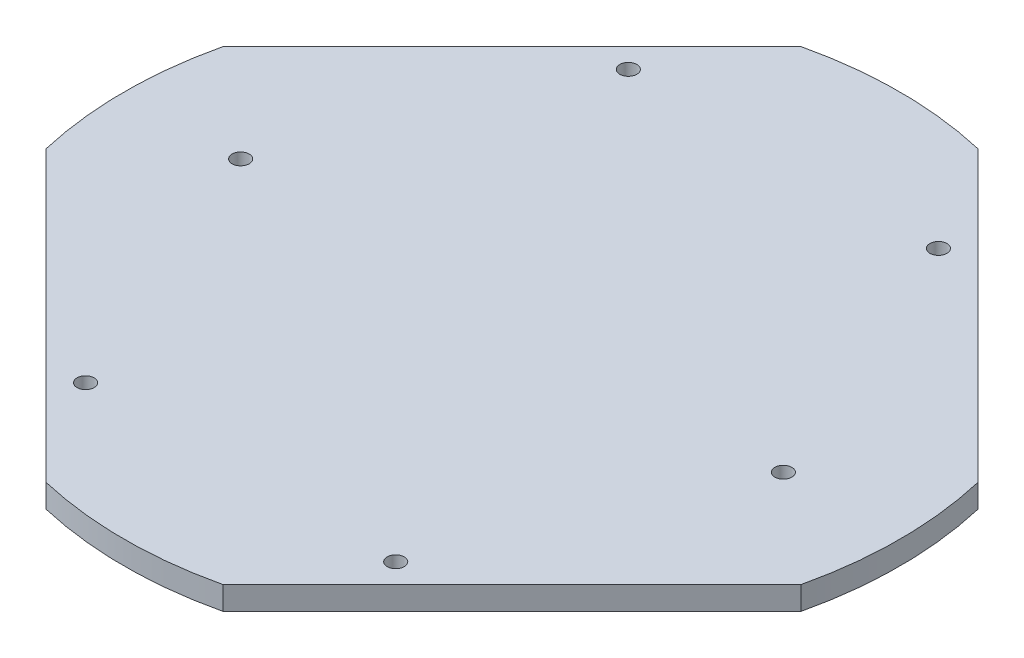
ISO-10303-21;
HEADER;
FILE_DESCRIPTION(('STEP AP214'),'2;1');
FILE_NAME('part.step','',(''),(''),'','','');
FILE_SCHEMA(('AUTOMOTIVE_DESIGN { 1 0 10303 214 1 1 1 1 }'));
ENDSEC;
DATA;
#1=APPLICATION_CONTEXT('core data for automotive mechanical design processes');
#2=APPLICATION_PROTOCOL_DEFINITION('international standard','automotive_design',2000,#1);
#3=PRODUCT_CONTEXT('',#1,'mechanical');
#4=PRODUCT('Part','Part','',(#3));
#5=PRODUCT_RELATED_PRODUCT_CATEGORY('part','',(#4));
#6=PRODUCT_DEFINITION_FORMATION('','',#4);
#7=PRODUCT_DEFINITION_CONTEXT('part definition',#1,'design');
#8=PRODUCT_DEFINITION('design','',#6,#7);
#9=PRODUCT_DEFINITION_SHAPE('','',#8);
#10=(LENGTH_UNIT() NAMED_UNIT(*) SI_UNIT(.MILLI.,.METRE.));
#11=(NAMED_UNIT(*) PLANE_ANGLE_UNIT() SI_UNIT($,.RADIAN.));
#12=(NAMED_UNIT(*) SI_UNIT($,.STERADIAN.) SOLID_ANGLE_UNIT());
#13=UNCERTAINTY_MEASURE_WITH_UNIT(LENGTH_MEASURE(1.E-05),#10,'distance_accuracy_value','');
#14=(GEOMETRIC_REPRESENTATION_CONTEXT(3) GLOBAL_UNCERTAINTY_ASSIGNED_CONTEXT((#13)) GLOBAL_UNIT_ASSIGNED_CONTEXT((#10,
#11,#12)) REPRESENTATION_CONTEXT('',''));
#15=CARTESIAN_POINT('',(0.,0.,0.));
#16=DIRECTION('',(0.,0.,1.));
#17=DIRECTION('',(1.,0.,0.));
#18=AXIS2_PLACEMENT_3D('',#15,#16,#17);
#19=CARTESIAN_POINT('',(0.,6.,0.));
#20=DIRECTION('',(0.,-1.,0.));
#21=DIRECTION('',(0.,0.,-1.));
#22=AXIS2_PLACEMENT_3D('',#19,#20,#21);
#23=CYLINDRICAL_SURFACE('',#22,100.);
#24=CARTESIAN_POINT('',(0.,0.,0.));
#25=DIRECTION('',(0.,1.,0.));
#26=DIRECTION('',(0.,0.,1.));
#27=AXIS2_PLACEMENT_3D('',#24,#25,#26);
#28=CIRCLE('',#27,100.);
#29=CARTESIAN_POINT('',(-22.8549153364782,0.,97.3532374652349));
#30=VERTEX_POINT('',#29);
#31=CARTESIAN_POINT('',(22.8549153364782,0.,97.3532374652349));
#32=VERTEX_POINT('',#31);
#33=EDGE_CURVE('E135',#30,#32,#28,.T.);
#34=ORIENTED_EDGE('',*,*,#33,.T.);
#35=DIRECTION('',(0.,-1.,0.));
#36=VECTOR('',#35,1.);
#37=CARTESIAN_POINT('',(22.8549153364782,6.,97.3532374652349));
#38=LINE('',#37,#36);
#39=CARTESIAN_POINT('',(22.8549153364782,6.,97.3532374652349));
#40=VERTEX_POINT('',#39);
#41=EDGE_CURVE('E11',#40,#32,#38,.T.);
#42=ORIENTED_EDGE('',*,*,#41,.F.);
#43=CARTESIAN_POINT('',(0.,6.,0.));
#44=DIRECTION('',(0.,1.,0.));
#45=DIRECTION('',(0.,0.,1.));
#46=AXIS2_PLACEMENT_3D('',#43,#44,#45);
#47=CIRCLE('',#46,100.);
#48=CARTESIAN_POINT('',(-22.8549153364782,6.,97.3532374652349));
#49=VERTEX_POINT('',#48);
#50=EDGE_CURVE('E150',#49,#40,#47,.T.);
#51=ORIENTED_EDGE('',*,*,#50,.F.);
#52=DIRECTION('',(0.,-1.,0.));
#53=VECTOR('',#52,1.);
#54=CARTESIAN_POINT('',(-22.8549153364782,6.,97.3532374652349));
#55=LINE('',#54,#53);
#56=EDGE_CURVE('E131',#49,#30,#55,.T.);
#57=ORIENTED_EDGE('',*,*,#56,.T.);
#58=EDGE_LOOP('',(#34,#42,#51,#57));
#59=FACE_BOUND('',#58,.T.);
#60=ADVANCED_FACE('F39',(#59),#23,.T.);
#61=CARTESIAN_POINT('',(97.3532374652349,6.,22.8549153364781));
#62=DIRECTION('',(-0.707106781186548,0.,-0.707106781186547));
#63=DIRECTION('',(-0.707106781186547,0.,0.707106781186548));
#64=AXIS2_PLACEMENT_3D('',#61,#62,#63);
#65=PLANE('',#64);
#66=DIRECTION('',(0.707106781186547,0.,-0.707106781186548));
#67=VECTOR('',#66,1.);
#68=CARTESIAN_POINT('',(97.3532374652349,0.,22.8549153364781));
#69=LINE('',#68,#67);
#70=CARTESIAN_POINT('',(97.3532374652349,0.,22.8549153364781));
#71=VERTEX_POINT('',#70);
#72=EDGE_CURVE('E138',#32,#71,#69,.T.);
#73=ORIENTED_EDGE('',*,*,#72,.T.);
#74=DIRECTION('',(0.,-1.,0.));
#75=VECTOR('',#74,1.);
#76=CARTESIAN_POINT('',(97.3532374652349,6.,22.8549153364781));
#77=LINE('',#76,#75);
#78=CARTESIAN_POINT('',(97.3532374652349,6.,22.8549153364781));
#79=VERTEX_POINT('',#78);
#80=EDGE_CURVE('E47',#79,#71,#77,.T.);
#81=ORIENTED_EDGE('',*,*,#80,.F.);
#82=DIRECTION('',(0.707106781186547,0.,-0.707106781186548));
#83=VECTOR('',#82,1.);
#84=CARTESIAN_POINT('',(97.3532374652349,6.,22.8549153364781));
#85=LINE('',#84,#83);
#86=EDGE_CURVE('E98',#40,#79,#85,.T.);
#87=ORIENTED_EDGE('',*,*,#86,.F.);
#88=ORIENTED_EDGE('',*,*,#41,.T.);
#89=EDGE_LOOP('',(#73,#81,#87,#88));
#90=FACE_BOUND('',#89,.T.);
#91=ADVANCED_FACE('F246',(#90),#65,.F.);
#92=CARTESIAN_POINT('',(0.,6.,0.));
#93=DIRECTION('',(0.,-1.,0.));
#94=DIRECTION('',(0.,0.,-1.));
#95=AXIS2_PLACEMENT_3D('',#92,#93,#94);
#96=CYLINDRICAL_SURFACE('',#95,100.);
#97=CARTESIAN_POINT('',(0.,0.,0.));
#98=DIRECTION('',(0.,1.,0.));
#99=DIRECTION('',(0.,0.,1.));
#100=AXIS2_PLACEMENT_3D('',#97,#98,#99);
#101=CIRCLE('',#100,100.);
#102=CARTESIAN_POINT('',(97.3532374652349,0.,-22.8549153364782));
#103=VERTEX_POINT('',#102);
#104=EDGE_CURVE('E141',#71,#103,#101,.T.);
#105=ORIENTED_EDGE('',*,*,#104,.T.);
#106=DIRECTION('',(0.,-1.,0.));
#107=VECTOR('',#106,1.);
#108=CARTESIAN_POINT('',(97.3532374652349,6.,-22.8549153364782));
#109=LINE('',#108,#107);
#110=CARTESIAN_POINT('',(97.3532374652349,6.,-22.8549153364782));
#111=VERTEX_POINT('',#110);
#112=EDGE_CURVE('E157',#111,#103,#109,.T.);
#113=ORIENTED_EDGE('',*,*,#112,.F.);
#114=CARTESIAN_POINT('',(0.,6.,0.));
#115=DIRECTION('',(0.,1.,0.));
#116=DIRECTION('',(0.,0.,1.));
#117=AXIS2_PLACEMENT_3D('',#114,#115,#116);
#118=CIRCLE('',#117,100.);
#119=EDGE_CURVE('E165',#79,#111,#118,.T.);
#120=ORIENTED_EDGE('',*,*,#119,.F.);
#121=ORIENTED_EDGE('',*,*,#80,.T.);
#122=EDGE_LOOP('',(#105,#113,#120,#121));
#123=FACE_BOUND('',#122,.T.);
#124=ADVANCED_FACE('F163',(#123),#96,.T.);
#125=CARTESIAN_POINT('',(97.3532374652349,6.,-22.8549153364782));
#126=DIRECTION('',(-0.707106781186547,0.,0.707106781186548));
#127=DIRECTION('',(0.707106781186548,0.,0.707106781186547));
#128=AXIS2_PLACEMENT_3D('',#125,#126,#127);
#129=PLANE('',#128);
#130=DIRECTION('',(-0.707106781186548,0.,-0.707106781186547));
#131=VECTOR('',#130,1.);
#132=CARTESIAN_POINT('',(97.3532374652349,0.,-22.8549153364782));
#133=LINE('',#132,#131);
#134=CARTESIAN_POINT('',(22.8549153364782,0.,-97.3532374652349));
#135=VERTEX_POINT('',#134);
#136=EDGE_CURVE('E143',#103,#135,#133,.T.);
#137=ORIENTED_EDGE('',*,*,#136,.T.);
#138=DIRECTION('',(0.,-1.,0.));
#139=VECTOR('',#138,1.);
#140=CARTESIAN_POINT('',(22.8549153364782,6.,-97.3532374652349));
#141=LINE('',#140,#139);
#142=CARTESIAN_POINT('',(22.8549153364782,6.,-97.3532374652349));
#143=VERTEX_POINT('',#142);
#144=EDGE_CURVE('E154',#143,#135,#141,.T.);
#145=ORIENTED_EDGE('',*,*,#144,.F.);
#146=DIRECTION('',(-0.707106781186548,0.,-0.707106781186547));
#147=VECTOR('',#146,1.);
#148=CARTESIAN_POINT('',(97.3532374652349,6.,-22.8549153364782));
#149=LINE('',#148,#147);
#150=EDGE_CURVE('E177',#111,#143,#149,.T.);
#151=ORIENTED_EDGE('',*,*,#150,.F.);
#152=ORIENTED_EDGE('',*,*,#112,.T.);
#153=EDGE_LOOP('',(#137,#145,#151,#152));
#154=FACE_BOUND('',#153,.T.);
#155=ADVANCED_FACE('F173',(#154),#129,.F.);
#156=CARTESIAN_POINT('',(0.,6.,0.));
#157=DIRECTION('',(0.,-1.,0.));
#158=DIRECTION('',(0.,0.,-1.));
#159=AXIS2_PLACEMENT_3D('',#156,#157,#158);
#160=CYLINDRICAL_SURFACE('',#159,100.);
#161=CARTESIAN_POINT('',(0.,0.,0.));
#162=DIRECTION('',(0.,1.,0.));
#163=DIRECTION('',(0.,0.,1.));
#164=AXIS2_PLACEMENT_3D('',#161,#162,#163);
#165=CIRCLE('',#164,100.);
#166=CARTESIAN_POINT('',(-22.8549153364782,0.,-97.3532374652349));
#167=VERTEX_POINT('',#166);
#168=EDGE_CURVE('E145',#135,#167,#165,.T.);
#169=ORIENTED_EDGE('',*,*,#168,.T.);
#170=DIRECTION('',(0.,-1.,0.));
#171=VECTOR('',#170,1.);
#172=CARTESIAN_POINT('',(-22.8549153364782,6.,-97.3532374652349));
#173=LINE('',#172,#171);
#174=CARTESIAN_POINT('',(-22.8549153364782,6.,-97.3532374652349));
#175=VERTEX_POINT('',#174);
#176=EDGE_CURVE('E126',#175,#167,#173,.T.);
#177=ORIENTED_EDGE('',*,*,#176,.F.);
#178=CARTESIAN_POINT('',(0.,6.,0.));
#179=DIRECTION('',(0.,1.,0.));
#180=DIRECTION('',(0.,0.,1.));
#181=AXIS2_PLACEMENT_3D('',#178,#179,#180);
#182=CIRCLE('',#181,100.);
#183=EDGE_CURVE('E117',#143,#175,#182,.T.);
#184=ORIENTED_EDGE('',*,*,#183,.F.);
#185=ORIENTED_EDGE('',*,*,#144,.T.);
#186=EDGE_LOOP('',(#169,#177,#184,#185));
#187=FACE_BOUND('',#186,.T.);
#188=ADVANCED_FACE('F176',(#187),#160,.T.);
#189=CARTESIAN_POINT('',(-22.8549153364782,6.,-97.3532374652349));
#190=DIRECTION('',(0.707106781186548,0.,0.707106781186547));
#191=DIRECTION('',(0.707106781186547,0.,-0.707106781186548));
#192=AXIS2_PLACEMENT_3D('',#189,#190,#191);
#193=PLANE('',#192);
#194=DIRECTION('',(-0.707106781186547,0.,0.707106781186548));
#195=VECTOR('',#194,1.);
#196=CARTESIAN_POINT('',(-22.8549153364782,0.,-97.3532374652349));
#197=LINE('',#196,#195);
#198=CARTESIAN_POINT('',(-97.3532374652349,0.,-22.8549153364782));
#199=VERTEX_POINT('',#198);
#200=EDGE_CURVE('E125',#167,#199,#197,.T.);
#201=ORIENTED_EDGE('',*,*,#200,.T.);
#202=DIRECTION('',(0.,-1.,0.));
#203=VECTOR('',#202,1.);
#204=CARTESIAN_POINT('',(-97.3532374652349,6.,-22.8549153364782));
#205=LINE('',#204,#203);
#206=CARTESIAN_POINT('',(-97.3532374652349,6.,-22.8549153364782));
#207=VERTEX_POINT('',#206);
#208=EDGE_CURVE('E122',#207,#199,#205,.T.);
#209=ORIENTED_EDGE('',*,*,#208,.F.);
#210=DIRECTION('',(-0.707106781186547,0.,0.707106781186548));
#211=VECTOR('',#210,1.);
#212=CARTESIAN_POINT('',(-22.8549153364782,6.,-97.3532374652349));
#213=LINE('',#212,#211);
#214=EDGE_CURVE('E111',#175,#207,#213,.T.);
#215=ORIENTED_EDGE('',*,*,#214,.F.);
#216=ORIENTED_EDGE('',*,*,#176,.T.);
#217=EDGE_LOOP('',(#201,#209,#215,#216));
#218=FACE_BOUND('',#217,.T.);
#219=ADVANCED_FACE('F123',(#218),#193,.F.);
#220=CARTESIAN_POINT('',(0.,6.,0.));
#221=DIRECTION('',(0.,-1.,0.));
#222=DIRECTION('',(0.,0.,-1.));
#223=AXIS2_PLACEMENT_3D('',#220,#221,#222);
#224=CYLINDRICAL_SURFACE('',#223,100.);
#225=CARTESIAN_POINT('',(0.,0.,0.));
#226=DIRECTION('',(0.,1.,0.));
#227=DIRECTION('',(0.,0.,1.));
#228=AXIS2_PLACEMENT_3D('',#225,#226,#227);
#229=CIRCLE('',#228,100.);
#230=CARTESIAN_POINT('',(-97.3532374652349,0.,22.8549153364782));
#231=VERTEX_POINT('',#230);
#232=EDGE_CURVE('E84',#199,#231,#229,.T.);
#233=ORIENTED_EDGE('',*,*,#232,.T.);
#234=DIRECTION('',(0.,-1.,0.));
#235=VECTOR('',#234,1.);
#236=CARTESIAN_POINT('',(-97.3532374652349,6.,22.8549153364782));
#237=LINE('',#236,#235);
#238=CARTESIAN_POINT('',(-97.3532374652349,6.,22.8549153364782));
#239=VERTEX_POINT('',#238);
#240=EDGE_CURVE('E127',#239,#231,#237,.T.);
#241=ORIENTED_EDGE('',*,*,#240,.F.);
#242=CARTESIAN_POINT('',(0.,6.,0.));
#243=DIRECTION('',(0.,1.,0.));
#244=DIRECTION('',(0.,0.,1.));
#245=AXIS2_PLACEMENT_3D('',#242,#243,#244);
#246=CIRCLE('',#245,100.);
#247=EDGE_CURVE('E115',#207,#239,#246,.T.);
#248=ORIENTED_EDGE('',*,*,#247,.F.);
#249=ORIENTED_EDGE('',*,*,#208,.T.);
#250=EDGE_LOOP('',(#233,#241,#248,#249));
#251=FACE_BOUND('',#250,.T.);
#252=ADVANCED_FACE('F129',(#251),#224,.T.);
#253=CARTESIAN_POINT('',(-22.8549153364782,6.,97.3532374652349));
#254=DIRECTION('',(0.707106781186547,0.,-0.707106781186548));
#255=DIRECTION('',(-0.707106781186548,0.,-0.707106781186547));
#256=AXIS2_PLACEMENT_3D('',#253,#254,#255);
#257=PLANE('',#256);
#258=DIRECTION('',(0.707106781186548,0.,0.707106781186547));
#259=VECTOR('',#258,1.);
#260=CARTESIAN_POINT('',(-22.8549153364782,0.,97.3532374652349));
#261=LINE('',#260,#259);
#262=EDGE_CURVE('E90',#231,#30,#261,.T.);
#263=ORIENTED_EDGE('',*,*,#262,.T.);
#264=ORIENTED_EDGE('',*,*,#56,.F.);
#265=DIRECTION('',(0.707106781186548,0.,0.707106781186547));
#266=VECTOR('',#265,1.);
#267=CARTESIAN_POINT('',(-22.8549153364782,6.,97.3532374652349));
#268=LINE('',#267,#266);
#269=EDGE_CURVE('E55',#239,#49,#268,.T.);
#270=ORIENTED_EDGE('',*,*,#269,.F.);
#271=ORIENTED_EDGE('',*,*,#240,.T.);
#272=EDGE_LOOP('',(#263,#264,#270,#271));
#273=FACE_BOUND('',#272,.T.);
#274=ADVANCED_FACE('F223',(#273),#257,.F.);
#275=CARTESIAN_POINT('',(0.,6.,0.));
#276=DIRECTION('',(0.,1.,0.));
#277=DIRECTION('',(0.,0.,1.));
#278=AXIS2_PLACEMENT_3D('',#275,#276,#277);
#279=PLANE('',#278);
#280=CARTESIAN_POINT('',(-70.,6.,0.));
#281=DIRECTION('',(0.,1.,0.));
#282=DIRECTION('',(0.,0.,1.));
#283=AXIS2_PLACEMENT_3D('',#280,#281,#282);
#284=CIRCLE('',#283,2.2);
#285=CARTESIAN_POINT('',(-70.,6.,2.2));
#286=VERTEX_POINT('',#285);
#287=EDGE_CURVE('E192',#286,#286,#284,.T.);
#288=ORIENTED_EDGE('',*,*,#287,.F.);
#289=EDGE_LOOP('',(#288));
#290=FACE_BOUND('',#289,.T.);
#291=CARTESIAN_POINT('',(40.,6.,70.));
#292=DIRECTION('',(0.,1.,0.));
#293=DIRECTION('',(0.,0.,1.));
#294=AXIS2_PLACEMENT_3D('',#291,#292,#293);
#295=CIRCLE('',#294,2.19999999999998);
#296=CARTESIAN_POINT('',(40.,6.,72.2));
#297=VERTEX_POINT('',#296);
#298=EDGE_CURVE('E186',#297,#297,#295,.T.);
#299=ORIENTED_EDGE('',*,*,#298,.F.);
#300=EDGE_LOOP('',(#299));
#301=FACE_BOUND('',#300,.T.);
#302=CARTESIAN_POINT('',(40.,6.,-70.));
#303=DIRECTION('',(0.,1.,0.));
#304=DIRECTION('',(0.,0.,1.));
#305=AXIS2_PLACEMENT_3D('',#302,#303,#304);
#306=CIRCLE('',#305,2.19999999999998);
#307=CARTESIAN_POINT('',(40.,6.,-67.8));
#308=VERTEX_POINT('',#307);
#309=EDGE_CURVE('E199',#308,#308,#306,.T.);
#310=ORIENTED_EDGE('',*,*,#309,.F.);
#311=EDGE_LOOP('',(#310));
#312=FACE_BOUND('',#311,.T.);
#313=CARTESIAN_POINT('',(-40.,6.,-70.));
#314=DIRECTION('',(0.,1.,0.));
#315=DIRECTION('',(0.,0.,1.));
#316=AXIS2_PLACEMENT_3D('',#313,#314,#315);
#317=CIRCLE('',#316,2.19999999999998);
#318=CARTESIAN_POINT('',(-40.,6.,-67.8));
#319=VERTEX_POINT('',#318);
#320=EDGE_CURVE('E200',#319,#319,#317,.T.);
#321=ORIENTED_EDGE('',*,*,#320,.F.);
#322=EDGE_LOOP('',(#321));
#323=FACE_BOUND('',#322,.T.);
#324=CARTESIAN_POINT('',(70.,6.,0.));
#325=DIRECTION('',(0.,1.,0.));
#326=DIRECTION('',(0.,0.,1.));
#327=AXIS2_PLACEMENT_3D('',#324,#325,#326);
#328=CIRCLE('',#327,2.2);
#329=CARTESIAN_POINT('',(70.,6.,2.19999999999997));
#330=VERTEX_POINT('',#329);
#331=EDGE_CURVE('E210',#330,#330,#328,.T.);
#332=ORIENTED_EDGE('',*,*,#331,.F.);
#333=EDGE_LOOP('',(#332));
#334=FACE_BOUND('',#333,.T.);
#335=CARTESIAN_POINT('',(-40.,6.,70.));
#336=DIRECTION('',(0.,1.,0.));
#337=DIRECTION('',(0.,0.,1.));
#338=AXIS2_PLACEMENT_3D('',#335,#336,#337);
#339=CIRCLE('',#338,2.2);
#340=CARTESIAN_POINT('',(-40.,6.,72.2));
#341=VERTEX_POINT('',#340);
#342=EDGE_CURVE('E183',#341,#341,#339,.T.);
#343=ORIENTED_EDGE('',*,*,#342,.F.);
#344=EDGE_LOOP('',(#343));
#345=FACE_BOUND('',#344,.T.);
#346=ORIENTED_EDGE('',*,*,#50,.T.);
#347=ORIENTED_EDGE('',*,*,#86,.T.);
#348=ORIENTED_EDGE('',*,*,#119,.T.);
#349=ORIENTED_EDGE('',*,*,#150,.T.);
#350=ORIENTED_EDGE('',*,*,#183,.T.);
#351=ORIENTED_EDGE('',*,*,#214,.T.);
#352=ORIENTED_EDGE('',*,*,#247,.T.);
#353=ORIENTED_EDGE('',*,*,#269,.T.);
#354=EDGE_LOOP('',(#346,#347,#348,#349,#350,#351,#352,#353));
#355=FACE_BOUND('',#354,.T.);
#356=ADVANCED_FACE('F113',(#290,#301,#312,#323,#334,#345,#355),#279,.T.);
#357=CARTESIAN_POINT('',(0.,0.,0.));
#358=DIRECTION('',(0.,1.,0.));
#359=DIRECTION('',(0.,0.,1.));
#360=AXIS2_PLACEMENT_3D('',#357,#358,#359);
#361=PLANE('',#360);
#362=CARTESIAN_POINT('',(-70.,0.,0.));
#363=DIRECTION('',(0.,1.,0.));
#364=DIRECTION('',(0.,0.,1.));
#365=AXIS2_PLACEMENT_3D('',#362,#363,#364);
#366=CIRCLE('',#365,2.2);
#367=CARTESIAN_POINT('',(-70.,0.,2.2));
#368=VERTEX_POINT('',#367);
#369=EDGE_CURVE('E189',#368,#368,#366,.T.);
#370=ORIENTED_EDGE('',*,*,#369,.T.);
#371=EDGE_LOOP('',(#370));
#372=FACE_BOUND('',#371,.T.);
#373=CARTESIAN_POINT('',(40.,0.,70.));
#374=DIRECTION('',(0.,1.,0.));
#375=DIRECTION('',(0.,0.,1.));
#376=AXIS2_PLACEMENT_3D('',#373,#374,#375);
#377=CIRCLE('',#376,2.19999999999998);
#378=CARTESIAN_POINT('',(40.,0.,72.2));
#379=VERTEX_POINT('',#378);
#380=EDGE_CURVE('E203',#379,#379,#377,.T.);
#381=ORIENTED_EDGE('',*,*,#380,.T.);
#382=EDGE_LOOP('',(#381));
#383=FACE_BOUND('',#382,.T.);
#384=CARTESIAN_POINT('',(40.,0.,-70.));
#385=DIRECTION('',(0.,1.,0.));
#386=DIRECTION('',(0.,0.,1.));
#387=AXIS2_PLACEMENT_3D('',#384,#385,#386);
#388=CIRCLE('',#387,2.19999999999998);
#389=CARTESIAN_POINT('',(40.,0.,-67.8));
#390=VERTEX_POINT('',#389);
#391=EDGE_CURVE('E196',#390,#390,#388,.T.);
#392=ORIENTED_EDGE('',*,*,#391,.T.);
#393=EDGE_LOOP('',(#392));
#394=FACE_BOUND('',#393,.T.);
#395=CARTESIAN_POINT('',(-40.,0.,-70.));
#396=DIRECTION('',(0.,1.,0.));
#397=DIRECTION('',(0.,0.,1.));
#398=AXIS2_PLACEMENT_3D('',#395,#396,#397);
#399=CIRCLE('',#398,2.19999999999998);
#400=CARTESIAN_POINT('',(-40.,0.,-67.8));
#401=VERTEX_POINT('',#400);
#402=EDGE_CURVE('E213',#401,#401,#399,.T.);
#403=ORIENTED_EDGE('',*,*,#402,.T.);
#404=EDGE_LOOP('',(#403));
#405=FACE_BOUND('',#404,.T.);
#406=CARTESIAN_POINT('',(70.,0.,0.));
#407=DIRECTION('',(0.,1.,0.));
#408=DIRECTION('',(0.,0.,1.));
#409=AXIS2_PLACEMENT_3D('',#406,#407,#408);
#410=CIRCLE('',#409,2.2);
#411=CARTESIAN_POINT('',(70.,0.,2.19999999999997));
#412=VERTEX_POINT('',#411);
#413=EDGE_CURVE('E195',#412,#412,#410,.T.);
#414=ORIENTED_EDGE('',*,*,#413,.T.);
#415=EDGE_LOOP('',(#414));
#416=FACE_BOUND('',#415,.T.);
#417=CARTESIAN_POINT('',(-40.,0.,70.));
#418=DIRECTION('',(0.,1.,0.));
#419=DIRECTION('',(0.,0.,1.));
#420=AXIS2_PLACEMENT_3D('',#417,#418,#419);
#421=CIRCLE('',#420,2.2);
#422=CARTESIAN_POINT('',(-40.,0.,72.2));
#423=VERTEX_POINT('',#422);
#424=EDGE_CURVE('E139',#423,#423,#421,.T.);
#425=ORIENTED_EDGE('',*,*,#424,.T.);
#426=EDGE_LOOP('',(#425));
#427=FACE_BOUND('',#426,.T.);
#428=ORIENTED_EDGE('',*,*,#33,.F.);
#429=ORIENTED_EDGE('',*,*,#262,.F.);
#430=ORIENTED_EDGE('',*,*,#232,.F.);
#431=ORIENTED_EDGE('',*,*,#200,.F.);
#432=ORIENTED_EDGE('',*,*,#168,.F.);
#433=ORIENTED_EDGE('',*,*,#136,.F.);
#434=ORIENTED_EDGE('',*,*,#104,.F.);
#435=ORIENTED_EDGE('',*,*,#72,.F.);
#436=EDGE_LOOP('',(#428,#429,#430,#431,#432,#433,#434,#435));
#437=FACE_BOUND('',#436,.T.);
#438=ADVANCED_FACE('F169',(#372,#383,#394,#405,#416,#427,#437),#361,.F.);
#439=CARTESIAN_POINT('',(-40.,0.,70.));
#440=DIRECTION('',(0.,1.,0.));
#441=DIRECTION('',(0.,0.,1.));
#442=AXIS2_PLACEMENT_3D('',#439,#440,#441);
#443=CYLINDRICAL_SURFACE('',#442,2.2);
#444=ORIENTED_EDGE('',*,*,#424,.F.);
#445=EDGE_LOOP('',(#444));
#446=FACE_BOUND('',#445,.T.);
#447=ORIENTED_EDGE('',*,*,#342,.T.);
#448=EDGE_LOOP('',(#447));
#449=FACE_BOUND('',#448,.T.);
#450=ADVANCED_FACE('F230',(#446,#449),#443,.F.);
#451=CARTESIAN_POINT('',(70.,0.,0.));
#452=DIRECTION('',(0.,1.,0.));
#453=DIRECTION('',(0.,0.,1.));
#454=AXIS2_PLACEMENT_3D('',#451,#452,#453);
#455=CYLINDRICAL_SURFACE('',#454,2.2);
#456=ORIENTED_EDGE('',*,*,#413,.F.);
#457=EDGE_LOOP('',(#456));
#458=FACE_BOUND('',#457,.T.);
#459=ORIENTED_EDGE('',*,*,#331,.T.);
#460=EDGE_LOOP('',(#459));
#461=FACE_BOUND('',#460,.T.);
#462=ADVANCED_FACE('F232',(#458,#461),#455,.F.);
#463=CARTESIAN_POINT('',(-40.,0.,-70.));
#464=DIRECTION('',(0.,1.,0.));
#465=DIRECTION('',(0.,0.,1.));
#466=AXIS2_PLACEMENT_3D('',#463,#464,#465);
#467=CYLINDRICAL_SURFACE('',#466,2.19999999999998);
#468=ORIENTED_EDGE('',*,*,#402,.F.);
#469=EDGE_LOOP('',(#468));
#470=FACE_BOUND('',#469,.T.);
#471=ORIENTED_EDGE('',*,*,#320,.T.);
#472=EDGE_LOOP('',(#471));
#473=FACE_BOUND('',#472,.T.);
#474=ADVANCED_FACE('F219',(#470,#473),#467,.F.);
#475=CARTESIAN_POINT('',(40.,0.,-70.));
#476=DIRECTION('',(0.,1.,0.));
#477=DIRECTION('',(0.,0.,1.));
#478=AXIS2_PLACEMENT_3D('',#475,#476,#477);
#479=CYLINDRICAL_SURFACE('',#478,2.19999999999998);
#480=ORIENTED_EDGE('',*,*,#391,.F.);
#481=EDGE_LOOP('',(#480));
#482=FACE_BOUND('',#481,.T.);
#483=ORIENTED_EDGE('',*,*,#309,.T.);
#484=EDGE_LOOP('',(#483));
#485=FACE_BOUND('',#484,.T.);
#486=ADVANCED_FACE('F327',(#482,#485),#479,.F.);
#487=CARTESIAN_POINT('',(40.,0.,70.));
#488=DIRECTION('',(0.,1.,0.));
#489=DIRECTION('',(0.,0.,1.));
#490=AXIS2_PLACEMENT_3D('',#487,#488,#489);
#491=CYLINDRICAL_SURFACE('',#490,2.19999999999998);
#492=ORIENTED_EDGE('',*,*,#380,.F.);
#493=EDGE_LOOP('',(#492));
#494=FACE_BOUND('',#493,.T.);
#495=ORIENTED_EDGE('',*,*,#298,.T.);
#496=EDGE_LOOP('',(#495));
#497=FACE_BOUND('',#496,.T.);
#498=ADVANCED_FACE('F337',(#494,#497),#491,.F.);
#499=CARTESIAN_POINT('',(-70.,0.,0.));
#500=DIRECTION('',(0.,1.,0.));
#501=DIRECTION('',(0.,0.,1.));
#502=AXIS2_PLACEMENT_3D('',#499,#500,#501);
#503=CYLINDRICAL_SURFACE('',#502,2.2);
#504=ORIENTED_EDGE('',*,*,#369,.F.);
#505=EDGE_LOOP('',(#504));
#506=FACE_BOUND('',#505,.T.);
#507=ORIENTED_EDGE('',*,*,#287,.T.);
#508=EDGE_LOOP('',(#507));
#509=FACE_BOUND('',#508,.T.);
#510=ADVANCED_FACE('F347',(#506,#509),#503,.F.);
#511=CLOSED_SHELL('',(#60,#91,#124,#155,#188,#219,#252,#274,#356,#438,#450,#462,#474,#486,#498,#510));
#512=MANIFOLD_SOLID_BREP('B2',#511);
#513=ADVANCED_BREP_SHAPE_REPRESENTATION('',(#18,#512),#14);
#514=SHAPE_DEFINITION_REPRESENTATION(#9,#513);
ENDSEC;
END-ISO-10303-21;
